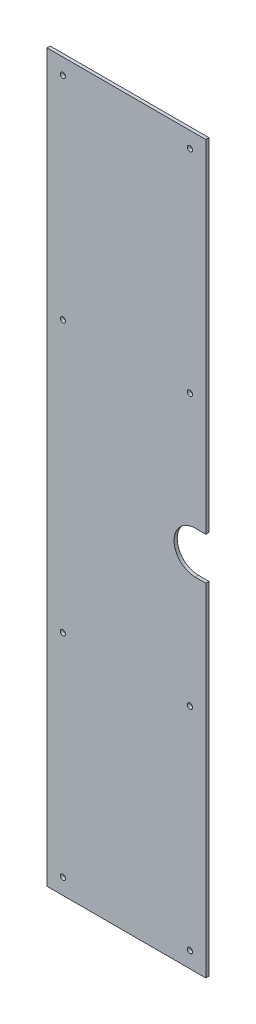
ISO-10303-21;
HEADER;
FILE_DESCRIPTION(('STEP AP214'),'2;1');
FILE_NAME('part.step','',(''),(''),'','','');
FILE_SCHEMA(('AUTOMOTIVE_DESIGN { 1 0 10303 214 1 1 1 1 }'));
ENDSEC;
DATA;
#1=APPLICATION_CONTEXT('core data for automotive mechanical design processes');
#2=APPLICATION_PROTOCOL_DEFINITION('international standard','automotive_design',2000,#1);
#3=PRODUCT_CONTEXT('',#1,'mechanical');
#4=PRODUCT('Part','Part','',(#3));
#5=PRODUCT_RELATED_PRODUCT_CATEGORY('part','',(#4));
#6=PRODUCT_DEFINITION_FORMATION('','',#4);
#7=PRODUCT_DEFINITION_CONTEXT('part definition',#1,'design');
#8=PRODUCT_DEFINITION('design','',#6,#7);
#9=PRODUCT_DEFINITION_SHAPE('','',#8);
#10=(LENGTH_UNIT() NAMED_UNIT(*) SI_UNIT(.MILLI.,.METRE.));
#11=(NAMED_UNIT(*) PLANE_ANGLE_UNIT() SI_UNIT($,.RADIAN.));
#12=(NAMED_UNIT(*) SI_UNIT($,.STERADIAN.) SOLID_ANGLE_UNIT());
#13=UNCERTAINTY_MEASURE_WITH_UNIT(LENGTH_MEASURE(1.E-05),#10,'distance_accuracy_value','');
#14=(GEOMETRIC_REPRESENTATION_CONTEXT(3) GLOBAL_UNCERTAINTY_ASSIGNED_CONTEXT((#13)) GLOBAL_UNIT_ASSIGNED_CONTEXT((#10,
#11,#12)) REPRESENTATION_CONTEXT('',''));
#15=CARTESIAN_POINT('',(0.,0.,0.));
#16=DIRECTION('',(0.,0.,1.));
#17=DIRECTION('',(1.,0.,0.));
#18=AXIS2_PLACEMENT_3D('',#15,#16,#17);
#19=CARTESIAN_POINT('',(75.,0.,3.));
#20=DIRECTION('',(-1.,0.,0.));
#21=DIRECTION('',(0.,0.,1.));
#22=AXIS2_PLACEMENT_3D('',#19,#20,#21);
#23=PLANE('',#22);
#24=DIRECTION('',(0.,0.,-1.));
#25=VECTOR('',#24,1.);
#26=CARTESIAN_POINT('',(75.,20.,3.000012));
#27=LINE('',#26,#25);
#28=CARTESIAN_POINT('',(75.,20.,3.));
#29=VERTEX_POINT('',#28);
#30=CARTESIAN_POINT('',(75.,20.,0.));
#31=VERTEX_POINT('',#30);
#32=EDGE_CURVE('E173',#29,#31,#27,.T.);
#33=ORIENTED_EDGE('',*,*,#32,.T.);
#34=DIRECTION('',(0.,1.,0.));
#35=VECTOR('',#34,1.);
#36=CARTESIAN_POINT('',(75.,0.,0.));
#37=LINE('',#36,#35);
#38=CARTESIAN_POINT('',(75.,343.,0.));
#39=VERTEX_POINT('',#38);
#40=EDGE_CURVE('E133',#31,#39,#37,.T.);
#41=ORIENTED_EDGE('',*,*,#40,.T.);
#42=DIRECTION('',(0.,0.,-1.));
#43=VECTOR('',#42,1.);
#44=CARTESIAN_POINT('',(75.,343.,3.));
#45=LINE('',#44,#43);
#46=CARTESIAN_POINT('',(75.,343.,3.));
#47=VERTEX_POINT('',#46);
#48=EDGE_CURVE('E163',#47,#39,#45,.T.);
#49=ORIENTED_EDGE('',*,*,#48,.F.);
#50=DIRECTION('',(0.,1.,0.));
#51=VECTOR('',#50,1.);
#52=CARTESIAN_POINT('',(75.,0.,3.));
#53=LINE('',#52,#51);
#54=EDGE_CURVE('E178',#29,#47,#53,.T.);
#55=ORIENTED_EDGE('',*,*,#54,.F.);
#56=EDGE_LOOP('',(#33,#41,#49,#55));
#57=FACE_BOUND('',#56,.T.);
#58=ADVANCED_FACE('F41',(#57),#23,.F.);
#59=DIRECTION('',(0.,0.,-1.));
#60=VECTOR('',#59,1.);
#61=CARTESIAN_POINT('',(75.,-20.,3.000012));
#62=LINE('',#61,#60);
#63=CARTESIAN_POINT('',(75.,-20.,3.));
#64=VERTEX_POINT('',#63);
#65=CARTESIAN_POINT('',(75.,-20.,0.));
#66=VERTEX_POINT('',#65);
#67=EDGE_CURVE('E168',#64,#66,#62,.T.);
#68=ORIENTED_EDGE('',*,*,#67,.F.);
#69=CARTESIAN_POINT('',(75.,-343.,3.));
#70=VERTEX_POINT('',#69);
#71=EDGE_CURVE('E121',#70,#64,#53,.T.);
#72=ORIENTED_EDGE('',*,*,#71,.F.);
#73=DIRECTION('',(0.,0.,-1.));
#74=VECTOR('',#73,1.);
#75=CARTESIAN_POINT('',(75.,-343.,3.));
#76=LINE('',#75,#74);
#77=CARTESIAN_POINT('',(75.,-343.,0.));
#78=VERTEX_POINT('',#77);
#79=EDGE_CURVE('E115',#70,#78,#76,.T.);
#80=ORIENTED_EDGE('',*,*,#79,.T.);
#81=EDGE_CURVE('E119',#78,#66,#37,.T.);
#82=ORIENTED_EDGE('',*,*,#81,.T.);
#83=EDGE_LOOP('',(#68,#72,#80,#82));
#84=FACE_BOUND('',#83,.T.);
#85=ADVANCED_FACE('F118',(#84),#23,.F.);
#86=CARTESIAN_POINT('',(0.,0.,3.));
#87=DIRECTION('',(0.,0.,1.));
#88=DIRECTION('',(1.,0.,0.));
#89=AXIS2_PLACEMENT_3D('',#86,#87,#88);
#90=PLANE('',#89);
#91=CARTESIAN_POINT('',(-60.0000000000001,128.,3.));
#92=DIRECTION('',(0.,0.,1.));
#93=DIRECTION('',(1.,0.,0.));
#94=AXIS2_PLACEMENT_3D('',#91,#92,#93);
#95=CIRCLE('',#94,2.50000000000002);
#96=CARTESIAN_POINT('',(-57.5,128.,3.));
#97=VERTEX_POINT('',#96);
#98=EDGE_CURVE('E158',#97,#97,#95,.F.);
#99=ORIENTED_EDGE('',*,*,#98,.T.);
#100=EDGE_LOOP('',(#99));
#101=FACE_BOUND('',#100,.T.);
#102=CARTESIAN_POINT('',(-60.0000000000001,328.,3.));
#103=DIRECTION('',(0.,0.,1.));
#104=DIRECTION('',(1.,0.,0.));
#105=AXIS2_PLACEMENT_3D('',#102,#103,#104);
#106=CIRCLE('',#105,2.50000000000002);
#107=CARTESIAN_POINT('',(-57.5,328.,3.));
#108=VERTEX_POINT('',#107);
#109=EDGE_CURVE('E191',#108,#108,#106,.F.);
#110=ORIENTED_EDGE('',*,*,#109,.T.);
#111=EDGE_LOOP('',(#110));
#112=FACE_BOUND('',#111,.T.);
#113=CARTESIAN_POINT('',(60.,-128.,3.));
#114=DIRECTION('',(0.,0.,1.));
#115=DIRECTION('',(1.,0.,0.));
#116=AXIS2_PLACEMENT_3D('',#113,#114,#115);
#117=CIRCLE('',#116,2.5);
#118=CARTESIAN_POINT('',(62.5,-128.,3.));
#119=VERTEX_POINT('',#118);
#120=EDGE_CURVE('E202',#119,#119,#117,.T.);
#121=ORIENTED_EDGE('',*,*,#120,.F.);
#122=EDGE_LOOP('',(#121));
#123=FACE_BOUND('',#122,.T.);
#124=CARTESIAN_POINT('',(-60.,-328.,3.));
#125=DIRECTION('',(0.,0.,1.));
#126=DIRECTION('',(1.,0.,0.));
#127=AXIS2_PLACEMENT_3D('',#124,#125,#126);
#128=CIRCLE('',#127,2.50000000000002);
#129=CARTESIAN_POINT('',(-57.5,-328.,3.));
#130=VERTEX_POINT('',#129);
#131=EDGE_CURVE('E205',#130,#130,#128,.T.);
#132=ORIENTED_EDGE('',*,*,#131,.F.);
#133=EDGE_LOOP('',(#132));
#134=FACE_BOUND('',#133,.T.);
#135=CARTESIAN_POINT('',(60.,-328.,3.));
#136=DIRECTION('',(0.,0.,1.));
#137=DIRECTION('',(1.,0.,0.));
#138=AXIS2_PLACEMENT_3D('',#135,#136,#137);
#139=CIRCLE('',#138,2.50000000000002);
#140=CARTESIAN_POINT('',(62.5,-328.,3.));
#141=VERTEX_POINT('',#140);
#142=EDGE_CURVE('E208',#141,#141,#139,.T.);
#143=ORIENTED_EDGE('',*,*,#142,.F.);
#144=EDGE_LOOP('',(#143));
#145=FACE_BOUND('',#144,.T.);
#146=CARTESIAN_POINT('',(-60.,-128.,3.));
#147=DIRECTION('',(0.,0.,1.));
#148=DIRECTION('',(1.,0.,0.));
#149=AXIS2_PLACEMENT_3D('',#146,#147,#148);
#150=CIRCLE('',#149,2.50000000000002);
#151=CARTESIAN_POINT('',(-57.5,-128.,3.));
#152=VERTEX_POINT('',#151);
#153=EDGE_CURVE('E211',#152,#152,#150,.T.);
#154=ORIENTED_EDGE('',*,*,#153,.F.);
#155=EDGE_LOOP('',(#154));
#156=FACE_BOUND('',#155,.T.);
#157=CARTESIAN_POINT('',(59.9999999999999,328.,3.));
#158=DIRECTION('',(0.,0.,1.));
#159=DIRECTION('',(1.,0.,0.));
#160=AXIS2_PLACEMENT_3D('',#157,#158,#159);
#161=CIRCLE('',#160,2.50000000000002);
#162=CARTESIAN_POINT('',(62.5,328.,3.));
#163=VERTEX_POINT('',#162);
#164=EDGE_CURVE('E214',#163,#163,#161,.F.);
#165=ORIENTED_EDGE('',*,*,#164,.T.);
#166=EDGE_LOOP('',(#165));
#167=FACE_BOUND('',#166,.T.);
#168=CARTESIAN_POINT('',(59.9999999999999,128.,3.));
#169=DIRECTION('',(0.,0.,1.));
#170=DIRECTION('',(1.,0.,0.));
#171=AXIS2_PLACEMENT_3D('',#168,#169,#170);
#172=CIRCLE('',#171,2.5);
#173=CARTESIAN_POINT('',(62.4999999999999,128.,3.));
#174=VERTEX_POINT('',#173);
#175=EDGE_CURVE('E123',#174,#174,#172,.F.);
#176=ORIENTED_EDGE('',*,*,#175,.T.);
#177=EDGE_LOOP('',(#176));
#178=FACE_BOUND('',#177,.T.);
#179=CARTESIAN_POINT('',(65.,0.,3.));
#180=DIRECTION('',(0.,0.,1.));
#181=DIRECTION('',(1.,0.,0.));
#182=AXIS2_PLACEMENT_3D('',#179,#180,#181);
#183=CIRCLE('',#182,20.);
#184=CARTESIAN_POINT('',(65.,20.,3.));
#185=VERTEX_POINT('',#184);
#186=CARTESIAN_POINT('',(65.,-20.,3.));
#187=VERTEX_POINT('',#186);
#188=EDGE_CURVE('E45',#185,#187,#183,.T.);
#189=ORIENTED_EDGE('',*,*,#188,.F.);
#190=DIRECTION('',(1.,0.,0.));
#191=VECTOR('',#190,1.);
#192=CARTESIAN_POINT('',(0.,19.9999999999999,3.));
#193=LINE('',#192,#191);
#194=EDGE_CURVE('E73',#185,#29,#193,.T.);
#195=ORIENTED_EDGE('',*,*,#194,.T.);
#196=ORIENTED_EDGE('',*,*,#54,.T.);
#197=DIRECTION('',(-1.,0.,0.));
#198=VECTOR('',#197,1.);
#199=CARTESIAN_POINT('',(0.,343.,3.));
#200=LINE('',#199,#198);
#201=CARTESIAN_POINT('',(-75.,343.,3.));
#202=VERTEX_POINT('',#201);
#203=EDGE_CURVE('E195',#47,#202,#200,.T.);
#204=ORIENTED_EDGE('',*,*,#203,.T.);
#205=DIRECTION('',(0.,1.,0.));
#206=VECTOR('',#205,1.);
#207=CARTESIAN_POINT('',(-75.,0.,3.));
#208=LINE('',#207,#206);
#209=CARTESIAN_POINT('',(-75.,-343.,3.));
#210=VERTEX_POINT('',#209);
#211=EDGE_CURVE('E197',#210,#202,#208,.T.);
#212=ORIENTED_EDGE('',*,*,#211,.F.);
#213=DIRECTION('',(-1.,0.,0.));
#214=VECTOR('',#213,1.);
#215=CARTESIAN_POINT('',(0.,-343.,3.));
#216=LINE('',#215,#214);
#217=EDGE_CURVE('E200',#70,#210,#216,.T.);
#218=ORIENTED_EDGE('',*,*,#217,.F.);
#219=ORIENTED_EDGE('',*,*,#71,.T.);
#220=DIRECTION('',(-1.,0.,0.));
#221=VECTOR('',#220,1.);
#222=CARTESIAN_POINT('',(0.,-19.9999999999999,3.));
#223=LINE('',#222,#221);
#224=EDGE_CURVE('E184',#64,#187,#223,.T.);
#225=ORIENTED_EDGE('',*,*,#224,.T.);
#226=EDGE_LOOP('',(#189,#195,#196,#204,#212,#218,#219,#225));
#227=FACE_BOUND('',#226,.T.);
#228=ADVANCED_FACE('F233',(#101,#112,#123,#134,#145,#156,#167,#178,#227),#90,.T.);
#229=CARTESIAN_POINT('',(0.,0.,0.));
#230=DIRECTION('',(0.,0.,1.));
#231=DIRECTION('',(1.,0.,0.));
#232=AXIS2_PLACEMENT_3D('',#229,#230,#231);
#233=PLANE('',#232);
#234=CARTESIAN_POINT('',(59.9999999999999,128.,0.));
#235=DIRECTION('',(0.,0.,1.));
#236=DIRECTION('',(1.,0.,0.));
#237=AXIS2_PLACEMENT_3D('',#234,#235,#236);
#238=CIRCLE('',#237,2.5);
#239=CARTESIAN_POINT('',(62.4999999999999,128.,0.));
#240=VERTEX_POINT('',#239);
#241=EDGE_CURVE('E156',#240,#240,#238,.F.);
#242=ORIENTED_EDGE('',*,*,#241,.F.);
#243=EDGE_LOOP('',(#242));
#244=FACE_BOUND('',#243,.T.);
#245=CARTESIAN_POINT('',(59.9999999999999,328.,0.));
#246=DIRECTION('',(0.,0.,1.));
#247=DIRECTION('',(1.,0.,0.));
#248=AXIS2_PLACEMENT_3D('',#245,#246,#247);
#249=CIRCLE('',#248,2.50000000000002);
#250=CARTESIAN_POINT('',(62.5,328.,0.));
#251=VERTEX_POINT('',#250);
#252=EDGE_CURVE('E153',#251,#251,#249,.F.);
#253=ORIENTED_EDGE('',*,*,#252,.F.);
#254=EDGE_LOOP('',(#253));
#255=FACE_BOUND('',#254,.T.);
#256=CARTESIAN_POINT('',(-60.,-128.,0.));
#257=DIRECTION('',(0.,0.,1.));
#258=DIRECTION('',(1.,0.,0.));
#259=AXIS2_PLACEMENT_3D('',#256,#257,#258);
#260=CIRCLE('',#259,2.50000000000002);
#261=CARTESIAN_POINT('',(-57.5,-128.,0.));
#262=VERTEX_POINT('',#261);
#263=EDGE_CURVE('E150',#262,#262,#260,.T.);
#264=ORIENTED_EDGE('',*,*,#263,.T.);
#265=EDGE_LOOP('',(#264));
#266=FACE_BOUND('',#265,.T.);
#267=CARTESIAN_POINT('',(60.,-328.,0.));
#268=DIRECTION('',(0.,0.,1.));
#269=DIRECTION('',(1.,0.,0.));
#270=AXIS2_PLACEMENT_3D('',#267,#268,#269);
#271=CIRCLE('',#270,2.50000000000002);
#272=CARTESIAN_POINT('',(62.5,-328.,0.));
#273=VERTEX_POINT('',#272);
#274=EDGE_CURVE('E147',#273,#273,#271,.T.);
#275=ORIENTED_EDGE('',*,*,#274,.T.);
#276=EDGE_LOOP('',(#275));
#277=FACE_BOUND('',#276,.T.);
#278=CARTESIAN_POINT('',(-60.,-328.,0.));
#279=DIRECTION('',(0.,0.,1.));
#280=DIRECTION('',(1.,0.,0.));
#281=AXIS2_PLACEMENT_3D('',#278,#279,#280);
#282=CIRCLE('',#281,2.50000000000002);
#283=CARTESIAN_POINT('',(-57.5,-328.,0.));
#284=VERTEX_POINT('',#283);
#285=EDGE_CURVE('E140',#284,#284,#282,.T.);
#286=ORIENTED_EDGE('',*,*,#285,.T.);
#287=EDGE_LOOP('',(#286));
#288=FACE_BOUND('',#287,.T.);
#289=CARTESIAN_POINT('',(60.,-128.,0.));
#290=DIRECTION('',(0.,0.,1.));
#291=DIRECTION('',(1.,0.,0.));
#292=AXIS2_PLACEMENT_3D('',#289,#290,#291);
#293=CIRCLE('',#292,2.5);
#294=CARTESIAN_POINT('',(62.5,-128.,0.));
#295=VERTEX_POINT('',#294);
#296=EDGE_CURVE('E136',#295,#295,#293,.T.);
#297=ORIENTED_EDGE('',*,*,#296,.T.);
#298=EDGE_LOOP('',(#297));
#299=FACE_BOUND('',#298,.T.);
#300=CARTESIAN_POINT('',(-60.0000000000001,328.,0.));
#301=DIRECTION('',(0.,0.,1.));
#302=DIRECTION('',(1.,0.,0.));
#303=AXIS2_PLACEMENT_3D('',#300,#301,#302);
#304=CIRCLE('',#303,2.50000000000002);
#305=CARTESIAN_POINT('',(-57.5,328.,0.));
#306=VERTEX_POINT('',#305);
#307=EDGE_CURVE('E221',#306,#306,#304,.F.);
#308=ORIENTED_EDGE('',*,*,#307,.F.);
#309=EDGE_LOOP('',(#308));
#310=FACE_BOUND('',#309,.T.);
#311=CARTESIAN_POINT('',(-60.0000000000001,128.,0.));
#312=DIRECTION('',(0.,0.,1.));
#313=DIRECTION('',(1.,0.,0.));
#314=AXIS2_PLACEMENT_3D('',#311,#312,#313);
#315=CIRCLE('',#314,2.50000000000002);
#316=CARTESIAN_POINT('',(-57.5,128.,0.));
#317=VERTEX_POINT('',#316);
#318=EDGE_CURVE('E188',#317,#317,#315,.F.);
#319=ORIENTED_EDGE('',*,*,#318,.F.);
#320=EDGE_LOOP('',(#319));
#321=FACE_BOUND('',#320,.T.);
#322=DIRECTION('',(1.,0.,0.));
#323=VECTOR('',#322,1.);
#324=CARTESIAN_POINT('',(0.,19.9999999999999,0.));
#325=LINE('',#324,#323);
#326=CARTESIAN_POINT('',(65.,20.,0.));
#327=VERTEX_POINT('',#326);
#328=EDGE_CURVE('E11',#327,#31,#325,.T.);
#329=ORIENTED_EDGE('',*,*,#328,.F.);
#330=CARTESIAN_POINT('',(65.,0.,0.));
#331=DIRECTION('',(0.,0.,1.));
#332=DIRECTION('',(1.,0.,0.));
#333=AXIS2_PLACEMENT_3D('',#330,#331,#332);
#334=CIRCLE('',#333,20.);
#335=CARTESIAN_POINT('',(65.,-20.,0.));
#336=VERTEX_POINT('',#335);
#337=EDGE_CURVE('E81',#327,#336,#334,.T.);
#338=ORIENTED_EDGE('',*,*,#337,.T.);
#339=DIRECTION('',(-1.,0.,0.));
#340=VECTOR('',#339,1.);
#341=CARTESIAN_POINT('',(0.,-19.9999999999999,0.));
#342=LINE('',#341,#340);
#343=EDGE_CURVE('E51',#66,#336,#342,.T.);
#344=ORIENTED_EDGE('',*,*,#343,.F.);
#345=ORIENTED_EDGE('',*,*,#81,.F.);
#346=DIRECTION('',(-1.,0.,0.));
#347=VECTOR('',#346,1.);
#348=CARTESIAN_POINT('',(0.,-343.,0.));
#349=LINE('',#348,#347);
#350=CARTESIAN_POINT('',(-75.,-343.,0.));
#351=VERTEX_POINT('',#350);
#352=EDGE_CURVE('E131',#78,#351,#349,.T.);
#353=ORIENTED_EDGE('',*,*,#352,.T.);
#354=DIRECTION('',(0.,1.,0.));
#355=VECTOR('',#354,1.);
#356=CARTESIAN_POINT('',(-75.,0.,0.));
#357=LINE('',#356,#355);
#358=CARTESIAN_POINT('',(-75.,343.,0.));
#359=VERTEX_POINT('',#358);
#360=EDGE_CURVE('E137',#351,#359,#357,.T.);
#361=ORIENTED_EDGE('',*,*,#360,.T.);
#362=DIRECTION('',(-1.,0.,0.));
#363=VECTOR('',#362,1.);
#364=CARTESIAN_POINT('',(0.,343.,0.));
#365=LINE('',#364,#363);
#366=EDGE_CURVE('E132',#39,#359,#365,.T.);
#367=ORIENTED_EDGE('',*,*,#366,.F.);
#368=ORIENTED_EDGE('',*,*,#40,.F.);
#369=EDGE_LOOP('',(#329,#338,#344,#345,#353,#361,#367,#368));
#370=FACE_BOUND('',#369,.T.);
#371=ADVANCED_FACE('F129',(#244,#255,#266,#277,#288,#299,#310,#321,#370),#233,.F.);
#372=CARTESIAN_POINT('',(0.,343.,3.));
#373=DIRECTION('',(0.,-1.,0.));
#374=DIRECTION('',(0.,0.,-1.));
#375=AXIS2_PLACEMENT_3D('',#372,#373,#374);
#376=PLANE('',#375);
#377=ORIENTED_EDGE('',*,*,#366,.T.);
#378=DIRECTION('',(0.,0.,-1.));
#379=VECTOR('',#378,1.);
#380=CARTESIAN_POINT('',(-75.,343.,3.));
#381=LINE('',#380,#379);
#382=EDGE_CURVE('E161',#202,#359,#381,.T.);
#383=ORIENTED_EDGE('',*,*,#382,.F.);
#384=ORIENTED_EDGE('',*,*,#203,.F.);
#385=ORIENTED_EDGE('',*,*,#48,.T.);
#386=EDGE_LOOP('',(#377,#383,#384,#385));
#387=FACE_BOUND('',#386,.T.);
#388=ADVANCED_FACE('F226',(#387),#376,.F.);
#389=CARTESIAN_POINT('',(-75.,0.,3.));
#390=DIRECTION('',(-1.,0.,0.));
#391=DIRECTION('',(0.,0.,1.));
#392=AXIS2_PLACEMENT_3D('',#389,#390,#391);
#393=PLANE('',#392);
#394=ORIENTED_EDGE('',*,*,#360,.F.);
#395=DIRECTION('',(0.,0.,-1.));
#396=VECTOR('',#395,1.);
#397=CARTESIAN_POINT('',(-75.,-343.,3.));
#398=LINE('',#397,#396);
#399=EDGE_CURVE('E109',#210,#351,#398,.T.);
#400=ORIENTED_EDGE('',*,*,#399,.F.);
#401=ORIENTED_EDGE('',*,*,#211,.T.);
#402=ORIENTED_EDGE('',*,*,#382,.T.);
#403=EDGE_LOOP('',(#394,#400,#401,#402));
#404=FACE_BOUND('',#403,.T.);
#405=ADVANCED_FACE('F229',(#404),#393,.T.);
#406=CARTESIAN_POINT('',(59.9999999999999,328.,3.));
#407=DIRECTION('',(0.,0.,-1.));
#408=DIRECTION('',(-1.,0.,0.));
#409=AXIS2_PLACEMENT_3D('',#406,#407,#408);
#410=CYLINDRICAL_SURFACE('',#409,2.50000000000002);
#411=ORIENTED_EDGE('',*,*,#164,.F.);
#412=EDGE_LOOP('',(#411));
#413=FACE_BOUND('',#412,.T.);
#414=ORIENTED_EDGE('',*,*,#252,.T.);
#415=EDGE_LOOP('',(#414));
#416=FACE_BOUND('',#415,.T.);
#417=ADVANCED_FACE('F283',(#413,#416),#410,.F.);
#418=CARTESIAN_POINT('',(-60.,-128.,3.));
#419=DIRECTION('',(0.,0.,-1.));
#420=DIRECTION('',(-1.,0.,0.));
#421=AXIS2_PLACEMENT_3D('',#418,#419,#420);
#422=CYLINDRICAL_SURFACE('',#421,2.50000000000002);
#423=ORIENTED_EDGE('',*,*,#153,.T.);
#424=EDGE_LOOP('',(#423));
#425=FACE_BOUND('',#424,.T.);
#426=ORIENTED_EDGE('',*,*,#263,.F.);
#427=EDGE_LOOP('',(#426));
#428=FACE_BOUND('',#427,.T.);
#429=ADVANCED_FACE('F286',(#425,#428),#422,.F.);
#430=CARTESIAN_POINT('',(60.,-328.,3.));
#431=DIRECTION('',(0.,0.,-1.));
#432=DIRECTION('',(-1.,0.,0.));
#433=AXIS2_PLACEMENT_3D('',#430,#431,#432);
#434=CYLINDRICAL_SURFACE('',#433,2.50000000000002);
#435=ORIENTED_EDGE('',*,*,#142,.T.);
#436=EDGE_LOOP('',(#435));
#437=FACE_BOUND('',#436,.T.);
#438=ORIENTED_EDGE('',*,*,#274,.F.);
#439=EDGE_LOOP('',(#438));
#440=FACE_BOUND('',#439,.T.);
#441=ADVANCED_FACE('F290',(#437,#440),#434,.F.);
#442=CARTESIAN_POINT('',(-60.,-328.,3.));
#443=DIRECTION('',(0.,0.,-1.));
#444=DIRECTION('',(-1.,0.,0.));
#445=AXIS2_PLACEMENT_3D('',#442,#443,#444);
#446=CYLINDRICAL_SURFACE('',#445,2.50000000000002);
#447=ORIENTED_EDGE('',*,*,#131,.T.);
#448=EDGE_LOOP('',(#447));
#449=FACE_BOUND('',#448,.T.);
#450=ORIENTED_EDGE('',*,*,#285,.F.);
#451=EDGE_LOOP('',(#450));
#452=FACE_BOUND('',#451,.T.);
#453=ADVANCED_FACE('F294',(#449,#452),#446,.F.);
#454=CARTESIAN_POINT('',(60.,-128.,3.));
#455=DIRECTION('',(0.,0.,-1.));
#456=DIRECTION('',(-1.,0.,0.));
#457=AXIS2_PLACEMENT_3D('',#454,#455,#456);
#458=CYLINDRICAL_SURFACE('',#457,2.5);
#459=ORIENTED_EDGE('',*,*,#120,.T.);
#460=EDGE_LOOP('',(#459));
#461=FACE_BOUND('',#460,.T.);
#462=ORIENTED_EDGE('',*,*,#296,.F.);
#463=EDGE_LOOP('',(#462));
#464=FACE_BOUND('',#463,.T.);
#465=ADVANCED_FACE('F258',(#461,#464),#458,.F.);
#466=CARTESIAN_POINT('',(0.,-343.,3.));
#467=DIRECTION('',(0.,-1.,0.));
#468=DIRECTION('',(0.,0.,-1.));
#469=AXIS2_PLACEMENT_3D('',#466,#467,#468);
#470=PLANE('',#469);
#471=ORIENTED_EDGE('',*,*,#352,.F.);
#472=ORIENTED_EDGE('',*,*,#79,.F.);
#473=ORIENTED_EDGE('',*,*,#217,.T.);
#474=ORIENTED_EDGE('',*,*,#399,.T.);
#475=EDGE_LOOP('',(#471,#472,#473,#474));
#476=FACE_BOUND('',#475,.T.);
#477=ADVANCED_FACE('F135',(#476),#470,.T.);
#478=CARTESIAN_POINT('',(-60.0000000000001,328.,3.));
#479=DIRECTION('',(0.,0.,-1.));
#480=DIRECTION('',(-1.,0.,0.));
#481=AXIS2_PLACEMENT_3D('',#478,#479,#480);
#482=CYLINDRICAL_SURFACE('',#481,2.50000000000002);
#483=ORIENTED_EDGE('',*,*,#109,.F.);
#484=EDGE_LOOP('',(#483));
#485=FACE_BOUND('',#484,.T.);
#486=ORIENTED_EDGE('',*,*,#307,.T.);
#487=EDGE_LOOP('',(#486));
#488=FACE_BOUND('',#487,.T.);
#489=ADVANCED_FACE('F249',(#485,#488),#482,.F.);
#490=CARTESIAN_POINT('',(-60.0000000000001,128.,3.));
#491=DIRECTION('',(0.,0.,-1.));
#492=DIRECTION('',(-1.,0.,0.));
#493=AXIS2_PLACEMENT_3D('',#490,#491,#492);
#494=CYLINDRICAL_SURFACE('',#493,2.50000000000002);
#495=ORIENTED_EDGE('',*,*,#98,.F.);
#496=EDGE_LOOP('',(#495));
#497=FACE_BOUND('',#496,.T.);
#498=ORIENTED_EDGE('',*,*,#318,.T.);
#499=EDGE_LOOP('',(#498));
#500=FACE_BOUND('',#499,.T.);
#501=ADVANCED_FACE('F43',(#497,#500),#494,.F.);
#502=CARTESIAN_POINT('',(59.9999999999999,128.,3.));
#503=DIRECTION('',(0.,0.,-1.));
#504=DIRECTION('',(-1.,0.,0.));
#505=AXIS2_PLACEMENT_3D('',#502,#503,#504);
#506=CYLINDRICAL_SURFACE('',#505,2.5);
#507=ORIENTED_EDGE('',*,*,#175,.F.);
#508=EDGE_LOOP('',(#507));
#509=FACE_BOUND('',#508,.T.);
#510=ORIENTED_EDGE('',*,*,#241,.T.);
#511=EDGE_LOOP('',(#510));
#512=FACE_BOUND('',#511,.T.);
#513=ADVANCED_FACE('F256',(#509,#512),#506,.F.);
#514=CARTESIAN_POINT('',(0.,19.9999999999999,3.000012));
#515=DIRECTION('',(0.,-1.,0.));
#516=DIRECTION('',(1.,0.,0.));
#517=AXIS2_PLACEMENT_3D('',#514,#515,#516);
#518=PLANE('',#517);
#519=DIRECTION('',(0.,0.,1.));
#520=VECTOR('',#519,1.);
#521=CARTESIAN_POINT('',(65.,20.,-7.));
#522=LINE('',#521,#520);
#523=EDGE_CURVE('E174',#327,#185,#522,.T.);
#524=ORIENTED_EDGE('',*,*,#523,.F.);
#525=ORIENTED_EDGE('',*,*,#328,.T.);
#526=ORIENTED_EDGE('',*,*,#32,.F.);
#527=ORIENTED_EDGE('',*,*,#194,.F.);
#528=EDGE_LOOP('',(#524,#525,#526,#527));
#529=FACE_BOUND('',#528,.T.);
#530=ADVANCED_FACE('F172',(#529),#518,.T.);
#531=CARTESIAN_POINT('',(0.,-19.9999999999999,3.000012));
#532=DIRECTION('',(0.,1.,0.));
#533=DIRECTION('',(-1.,0.,0.));
#534=AXIS2_PLACEMENT_3D('',#531,#532,#533);
#535=PLANE('',#534);
#536=ORIENTED_EDGE('',*,*,#67,.T.);
#537=ORIENTED_EDGE('',*,*,#343,.T.);
#538=DIRECTION('',(0.,0.,1.));
#539=VECTOR('',#538,1.);
#540=CARTESIAN_POINT('',(65.,-20.,-7.));
#541=LINE('',#540,#539);
#542=EDGE_CURVE('E59',#336,#187,#541,.T.);
#543=ORIENTED_EDGE('',*,*,#542,.T.);
#544=ORIENTED_EDGE('',*,*,#224,.F.);
#545=EDGE_LOOP('',(#536,#537,#543,#544));
#546=FACE_BOUND('',#545,.T.);
#547=ADVANCED_FACE('F167',(#546),#535,.T.);
#548=CARTESIAN_POINT('',(65.,0.,-7.));
#549=DIRECTION('',(0.,0.,1.));
#550=DIRECTION('',(1.,0.,0.));
#551=AXIS2_PLACEMENT_3D('',#548,#549,#550);
#552=CYLINDRICAL_SURFACE('',#551,20.);
#553=ORIENTED_EDGE('',*,*,#188,.T.);
#554=ORIENTED_EDGE('',*,*,#542,.F.);
#555=ORIENTED_EDGE('',*,*,#337,.F.);
#556=ORIENTED_EDGE('',*,*,#523,.T.);
#557=EDGE_LOOP('',(#553,#554,#555,#556));
#558=FACE_BOUND('',#557,.T.);
#559=ADVANCED_FACE('F234',(#558),#552,.F.);
#560=CLOSED_SHELL('',(#58,#85,#228,#371,#388,#405,#417,#429,#441,#453,#465,#477,#489,#501,#513,
#530,#547,#559));
#561=MANIFOLD_SOLID_BREP('B2',#560);
#562=ADVANCED_BREP_SHAPE_REPRESENTATION('',(#18,#561),#14);
#563=SHAPE_DEFINITION_REPRESENTATION(#9,#562);
ENDSEC;
END-ISO-10303-21;
